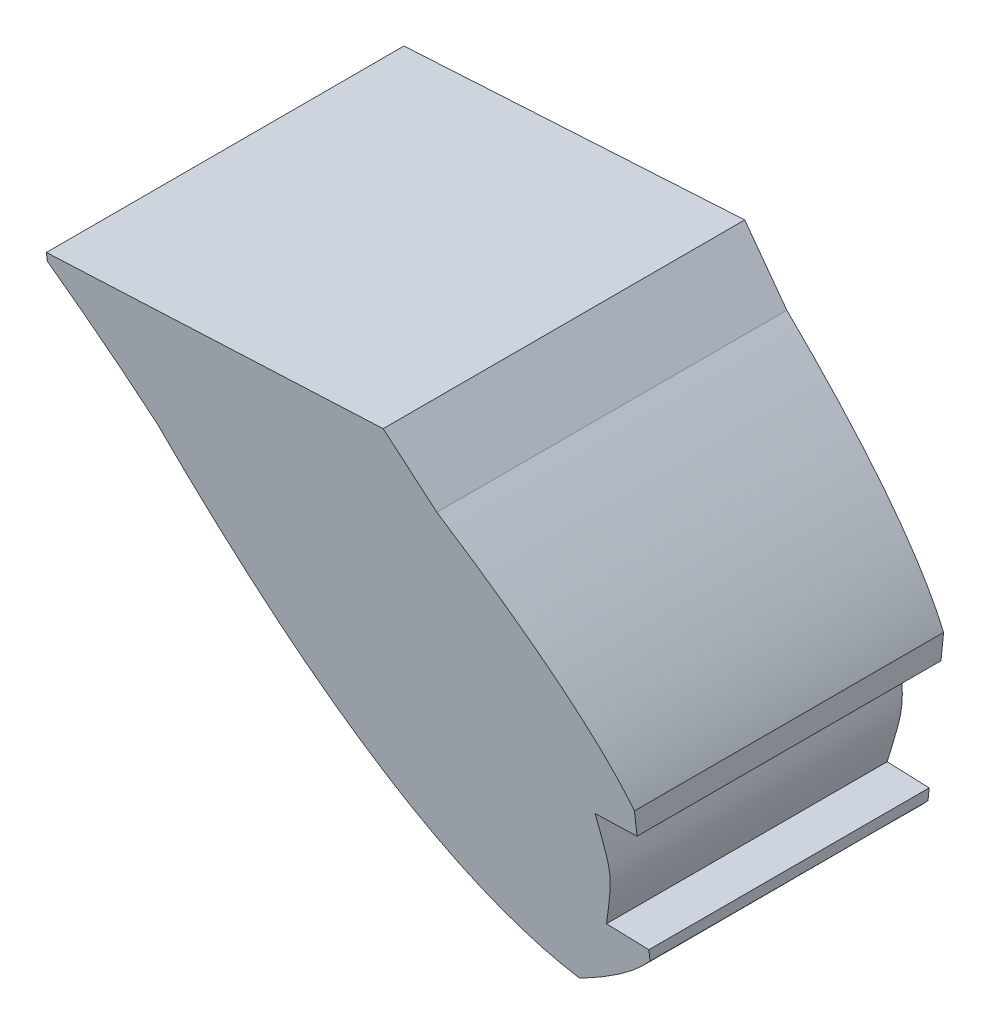
ISO-10303-21;
HEADER;
FILE_DESCRIPTION(('STEP AP214'),'2;1');
FILE_NAME('part.step','',(''),(''),'','','');
FILE_SCHEMA(('AUTOMOTIVE_DESIGN { 1 0 10303 214 1 1 1 1 }'));
ENDSEC;
DATA;
#1=APPLICATION_CONTEXT('core data for automotive mechanical design processes');
#2=APPLICATION_PROTOCOL_DEFINITION('international standard','automotive_design',2000,#1);
#3=PRODUCT_CONTEXT('',#1,'mechanical');
#4=PRODUCT('Part','Part','',(#3));
#5=PRODUCT_RELATED_PRODUCT_CATEGORY('part','',(#4));
#6=PRODUCT_DEFINITION_FORMATION('','',#4);
#7=PRODUCT_DEFINITION_CONTEXT('part definition',#1,'design');
#8=PRODUCT_DEFINITION('design','',#6,#7);
#9=PRODUCT_DEFINITION_SHAPE('','',#8);
#10=(LENGTH_UNIT() NAMED_UNIT(*) SI_UNIT(.MILLI.,.METRE.));
#11=(NAMED_UNIT(*) PLANE_ANGLE_UNIT() SI_UNIT($,.RADIAN.));
#12=(NAMED_UNIT(*) SI_UNIT($,.STERADIAN.) SOLID_ANGLE_UNIT());
#13=UNCERTAINTY_MEASURE_WITH_UNIT(LENGTH_MEASURE(1.E-05),#10,'distance_accuracy_value','');
#14=(GEOMETRIC_REPRESENTATION_CONTEXT(3) GLOBAL_UNCERTAINTY_ASSIGNED_CONTEXT((#13)) GLOBAL_UNIT_ASSIGNED_CONTEXT((#10,
#11,#12)) REPRESENTATION_CONTEXT('',''));
#15=CARTESIAN_POINT('',(0.,0.,0.));
#16=DIRECTION('',(0.,0.,1.));
#17=DIRECTION('',(1.,0.,0.));
#18=AXIS2_PLACEMENT_3D('',#15,#16,#17);
#19=CARTESIAN_POINT('',(0.355125000055651,-1.23774703808888E-13,7.5));
#20=DIRECTION('',(-1.,3.48538412642003E-13,0.));
#21=DIRECTION('',(-3.48538412642003E-13,-1.,0.));
#22=AXIS2_PLACEMENT_3D('',#19,#20,#21);
#23=PLANE('',#22);
#24=DIRECTION('',(0.,-0.993653373689782,0.112485434412263));
#25=VECTOR('',#24,1.);
#26=CARTESIAN_POINT('',(0.355125000056697,12.6081551722012,-7.5));
#27=LINE('',#26,#25);
#28=CARTESIAN_POINT('',(0.355125000056697,3.0015495286345,-6.41249480185305));
#29=VERTEX_POINT('',#28);
#30=CARTESIAN_POINT('',(0.355125000056447,2.03738091179555,-6.30334715682562));
#31=VERTEX_POINT('',#30);
#32=EDGE_CURVE('E59',#29,#31,#27,.T.);
#33=ORIENTED_EDGE('',*,*,#32,.F.);
#34=DIRECTION('',(0.,0.,-1.));
#35=VECTOR('',#34,1.);
#36=CARTESIAN_POINT('',(0.355125000056697,3.0015495286345,7.5));
#37=LINE('',#36,#35);
#38=CARTESIAN_POINT('',(0.355125000056697,3.0015495286345,6.41249480185305));
#39=VERTEX_POINT('',#38);
#40=EDGE_CURVE('E179',#39,#29,#37,.T.);
#41=ORIENTED_EDGE('',*,*,#40,.F.);
#42=DIRECTION('',(0.,0.993653373689782,0.112485434412263));
#43=VECTOR('',#42,1.);
#44=CARTESIAN_POINT('',(0.355125000056697,12.6081551722012,7.5));
#45=LINE('',#44,#43);
#46=CARTESIAN_POINT('',(0.355125000056697,2.03738091179556,6.30334715682562));
#47=VERTEX_POINT('',#46);
#48=EDGE_CURVE('E151',#47,#39,#45,.T.);
#49=ORIENTED_EDGE('',*,*,#48,.F.);
#50=DIRECTION('',(0.,0.,-1.));
#51=VECTOR('',#50,1.);
#52=CARTESIAN_POINT('',(0.355125000056447,2.03738091179555,7.5));
#53=LINE('',#52,#51);
#54=EDGE_CURVE('E166',#47,#31,#53,.T.);
#55=ORIENTED_EDGE('',*,*,#54,.T.);
#56=EDGE_LOOP('',(#33,#41,#49,#55));
#57=FACE_BOUND('',#56,.T.);
#58=ADVANCED_FACE('F41',(#57),#23,.F.);
#59=CARTESIAN_POINT('',(-23.0359211456035,0.,7.5));
#60=DIRECTION('',(-1.,0.,0.));
#61=DIRECTION('',(0.,0.,1.));
#62=AXIS2_PLACEMENT_3D('',#59,#60,#61);
#63=PLANE('',#62);
#64=DIRECTION('',(0.,0.,-1.));
#65=VECTOR('',#64,1.);
#66=CARTESIAN_POINT('',(-23.0359211456035,11.8716122879342,7.5));
#67=LINE('',#66,#65);
#68=CARTESIAN_POINT('',(-23.0359211456035,11.8716122879342,7.41662047501294));
#69=VERTEX_POINT('',#68);
#70=CARTESIAN_POINT('',(-23.0359211456035,11.8716122879342,-7.41662047501294));
#71=VERTEX_POINT('',#70);
#72=EDGE_CURVE('E187',#69,#71,#67,.T.);
#73=ORIENTED_EDGE('',*,*,#72,.T.);
#74=DIRECTION('',(0.,-0.993653373689782,0.112485434412263));
#75=VECTOR('',#74,1.);
#76=CARTESIAN_POINT('',(-23.0359211456035,12.6081551722012,-7.5));
#77=LINE('',#76,#75);
#78=CARTESIAN_POINT('',(-23.0359211456035,11.5401378200983,-7.37909627341673));
#79=VERTEX_POINT('',#78);
#80=EDGE_CURVE('E317',#71,#79,#77,.T.);
#81=ORIENTED_EDGE('',*,*,#80,.T.);
#82=DIRECTION('',(0.,0.,-1.));
#83=VECTOR('',#82,1.);
#84=CARTESIAN_POINT('',(-23.0359211456035,11.5401378200983,7.5));
#85=LINE('',#84,#83);
#86=CARTESIAN_POINT('',(-23.0359211456035,11.5401378200983,7.37909627341673));
#87=VERTEX_POINT('',#86);
#88=EDGE_CURVE('E193',#87,#79,#85,.T.);
#89=ORIENTED_EDGE('',*,*,#88,.F.);
#90=DIRECTION('',(0.,0.993653373689782,0.112485434412263));
#91=VECTOR('',#90,1.);
#92=CARTESIAN_POINT('',(-23.0359211456035,12.6081551722012,7.5));
#93=LINE('',#92,#91);
#94=EDGE_CURVE('E320',#87,#69,#93,.T.);
#95=ORIENTED_EDGE('',*,*,#94,.T.);
#96=EDGE_LOOP('',(#73,#81,#89,#95));
#97=FACE_BOUND('',#96,.T.);
#98=ADVANCED_FACE('F316',(#97),#63,.T.);
#99=CARTESIAN_POINT('',(-18.9451921135982,7.54091889574655,7.5));
#100=CARTESIAN_POINT('',(-10.2150083842792,-3.69764410322756,7.5));
#101=CARTESIAN_POINT('',(-2.84660482498738,-5.05908110388432,7.5));
#102=(BOUNDED_CURVE() B_SPLINE_CURVE(2,(#99,#100,#101),.UNSPECIFIED.,.F.,
.F.) B_SPLINE_CURVE_WITH_KNOTS((3,3),(0.497667241108509,0.499554279588011),
.UNSPECIFIED.) CURVE() GEOMETRIC_REPRESENTATION_ITEM() RATIONAL_B_SPLINE_CURVE((1.,1.,1.)) REPRESENTATION_ITEM(''));
#103=DIRECTION('',(0.,0.,-1.));
#104=VECTOR('',#103,1.);
#105=SURFACE_OF_LINEAR_EXTRUSION('',#102,#104);
#106=DIRECTION('',(0.,0.,-1.));
#107=VECTOR('',#106,1.);
#108=CARTESIAN_POINT('',(-18.9451921135982,7.54091889574657,7.5));
#109=LINE('',#108,#107);
#110=CARTESIAN_POINT('',(-18.9451921135982,7.54091889574657,6.92636910524441));
#111=VERTEX_POINT('',#110);
#112=CARTESIAN_POINT('',(-18.9451921135982,7.54091889574657,-6.92636910524441));
#113=VERTEX_POINT('',#112);
#114=EDGE_CURVE('E194',#111,#113,#109,.T.);
#115=ORIENTED_EDGE('',*,*,#114,.T.);
#116=CARTESIAN_POINT('',(-18.9451921135982,7.54091889574655,-6.92636910524441));
#117=CARTESIAN_POINT('',(-18.7033608655423,7.22962108931645,-6.89112898035273));
#118=CARTESIAN_POINT('',(-18.4592647140916,6.9200497206851,-6.85608429494821));
#119=CARTESIAN_POINT('',(-17.9661198805234,6.30464603742845,-6.78641819962467));
#120=CARTESIAN_POINT('',(-17.7170694462669,5.99881510969872,-6.75179694670763));
#121=CARTESIAN_POINT('',(-17.2137366178937,5.3913665824337,-6.68303140604553));
#122=CARTESIAN_POINT('',(-16.9594535947769,5.08974949683998,-6.64888717648066));
#123=CARTESIAN_POINT('',(-16.4451285665965,4.49103725761873,-6.58111061767257));
#124=CARTESIAN_POINT('',(-16.1850826962375,4.19394537928884,-6.54747865920581));
#125=CARTESIAN_POINT('',(-15.6590118901181,3.60508061675355,-6.4808168731366));
#126=CARTESIAN_POINT('',(-15.3929875534481,3.31330720485499,-6.44778698579723));
#127=CARTESIAN_POINT('',(-14.8544901847056,2.7357195544677,-6.38240181277285));
#128=CARTESIAN_POINT('',(-14.5820174931064,2.44990500284308,-6.35004649163962));
#129=CARTESIAN_POINT('',(-13.9777704357619,1.83142011947111,-6.28003159245484));
#130=CARTESIAN_POINT('',(-13.6445482479649,1.50014167377654,-6.24252958132897));
#131=CARTESIAN_POINT('',(-12.9673134934436,0.848664446736888,-6.16877982026175));
#132=CARTESIAN_POINT('',(-12.623301443116,0.528465136688492,-6.13253201046914));
#133=CARTESIAN_POINT('',(-11.9227759490938,-0.0995013958587513,-6.0614437516454));
#134=CARTESIAN_POINT('',(-11.5662405708663,-0.407244542107335,-6.02660602813964));
#135=CARTESIAN_POINT('',(-10.840142749037,-1.00720368374379,-5.95868831511867));
#136=CARTESIAN_POINT('',(-10.4705807273197,-1.29942018121482,-5.9256082687657));
#137=CARTESIAN_POINT('',(-9.71382699072171,-1.86779135556405,-5.86126643674768));
#138=CARTESIAN_POINT('',(-9.32650636654571,-2.14377746328672,-5.830023733768));
#139=CARTESIAN_POINT('',(-8.5360986768139,-2.67282289543975,-5.77013372902864));
#140=CARTESIAN_POINT('',(-8.13300835344273,-2.92587744631612,-5.74148696765387));
#141=CARTESIAN_POINT('',(-7.31201826568453,-3.40280761684766,-5.68749661363601));
#142=CARTESIAN_POINT('',(-6.89419365451789,-3.62680992502778,-5.66213867935817));
#143=CARTESIAN_POINT('',(-6.04187322097519,-4.0405536088069,-5.61530128189388));
#144=CARTESIAN_POINT('',(-5.60738935372736,-4.23031901573022,-5.59381909826786));
#145=CARTESIAN_POINT('',(-4.78985442909107,-4.54236533838515,-5.55849423842238));
#146=CARTESIAN_POINT('',(-4.4091055725695,-4.67052923075731,-5.54398558631979));
#147=CARTESIAN_POINT('',(-3.82960691198316,-4.83674345690554,-5.52516948814227));
#148=CARTESIAN_POINT('',(-3.63462104960687,-4.8878904691115,-5.51937944702812));
#149=CARTESIAN_POINT('',(-3.24229120544362,-4.9807402777546,-5.50886848683127));
#150=CARTESIAN_POINT('',(-3.0449461414238,-5.02243854990591,-5.50414807991536));
#151=CARTESIAN_POINT('',(-2.84660482498738,-5.05908110388432,-5.5));
#152=B_SPLINE_CURVE_WITH_KNOTS('',3,(#116,#117,#118,#119,#120,#121,#122,#123,#124,#125,#126,
#127,#128,#129,#130,#131,#132,#133,#134,#135,#136,#137,#138,#139,#140,#141,#142,#143,#144,#145,
#146,#147,#148,#149,#150,#151),.UNSPECIFIED.,.F.,.F.,(4,2,2,2,2,2,2,2,2,2,2,2,2,2,2,2,2,4),(0.,
1.1872997216569,2.37502708567824,3.56289806807204,4.75159146291787,5.9401662676152,
7.12867845491363,8.54255640265696,9.95636678593971,11.3727907462706,12.7891688759803,
14.2183172044781,15.6477623519031,17.0707480146133,18.4927309460623,19.6971402338765,
20.3019233237111,20.9069953892921),.UNSPECIFIED.);
#153=CARTESIAN_POINT('',(-2.84660482498738,-5.05908110388432,-5.5));
#154=VERTEX_POINT('',#153);
#155=EDGE_CURVE('E255',#113,#154,#152,.T.);
#156=ORIENTED_EDGE('',*,*,#155,.T.);
#157=DIRECTION('',(0.,0.,-1.));
#158=VECTOR('',#157,1.);
#159=CARTESIAN_POINT('',(-2.84660482498738,-5.05908110388432,7.5));
#160=LINE('',#159,#158);
#161=CARTESIAN_POINT('',(-2.84660482498738,-5.05908110388432,5.5));
#162=VERTEX_POINT('',#161);
#163=EDGE_CURVE('E156',#162,#154,#160,.T.);
#164=ORIENTED_EDGE('',*,*,#163,.F.);
#165=CARTESIAN_POINT('',(-2.84660482498738,-5.05908110388432,5.5));
#166=CARTESIAN_POINT('',(-3.0836355452615,-5.01529762547054,5.50495646039138));
#167=CARTESIAN_POINT('',(-3.31925014057108,-4.96428184629726,5.51073164541478));
#168=CARTESIAN_POINT('',(-3.78628189704186,-4.84911384389608,5.52376911212451));
#169=CARTESIAN_POINT('',(-4.01771143135529,-4.78501130060695,5.53102576984815));
#170=CARTESIAN_POINT('',(-4.47638324853452,-4.64477679089168,5.54690086287615));
#171=CARTESIAN_POINT('',(-4.70363211310207,-4.56866593727755,5.55551690812791));
#172=CARTESIAN_POINT('',(-5.15398016115681,-4.40545252874729,5.57399330205617));
#173=CARTESIAN_POINT('',(-5.37708095327682,-4.31835434125152,5.58385315632366));
#174=CARTESIAN_POINT('',(-5.81545834234536,-4.13567110279715,5.60453361087802));
#175=CARTESIAN_POINT('',(-6.03080317783365,-4.04024711994086,5.61533597762798));
#176=CARTESIAN_POINT('',(-6.45748946905634,-3.84057736608456,5.63793937192645));
#177=CARTESIAN_POINT('',(-6.66882789943329,-3.73632522989765,5.64974112003892));
#178=CARTESIAN_POINT('',(-7.08747417766979,-3.51983158147829,5.67424904476877));
#179=CARTESIAN_POINT('',(-7.29477947597257,-3.40758521204135,5.68695577124062));
#180=CARTESIAN_POINT('',(-7.70530843131035,-3.17590609220346,5.71318275051655));
#181=CARTESIAN_POINT('',(-7.90853147430462,-3.0564722713248,5.72670312450288));
#182=CARTESIAN_POINT('',(-8.45410340689061,-2.72385368196738,5.76435684511426));
#183=CARTESIAN_POINT('',(-8.79259906035209,-2.50440768840731,5.78919898682003));
#184=CARTESIAN_POINT('',(-9.45845448583479,-2.04949644973372,5.8406967119384));
#185=CARTESIAN_POINT('',(-9.78581359629267,-1.81403025542841,5.8673524028032));
#186=CARTESIAN_POINT('',(-10.4302582396863,-1.32938575303013,5.92221604925302));
#187=CARTESIAN_POINT('',(-10.7473396395034,-1.08020203459831,5.95042461730948));
#188=CARTESIAN_POINT('',(-11.3718438106499,-0.570176876647104,6.00816145288252));
#189=CARTESIAN_POINT('',(-11.6792662750814,-0.309335067346119,6.03768976225981));
#190=CARTESIAN_POINT('',(-12.2887351366992,0.225514030316342,6.09823676455314));
#191=CARTESIAN_POINT('',(-12.5906756597182,0.499640146613562,6.12926890925461));
#192=CARTESIAN_POINT('',(-13.1859914625247,1.05668157973797,6.19232817041119));
#193=CARTESIAN_POINT('',(-13.4793699933214,1.33959347409339,6.22435489942917));
#194=CARTESIAN_POINT('',(-14.0582984741035,1.91313890151101,6.28928247705986));
#195=CARTESIAN_POINT('',(-14.3438493181123,2.20377154523463,6.32218322499598));
#196=CARTESIAN_POINT('',(-14.9077244427009,2.7918210558895,6.38875272137508));
#197=CARTESIAN_POINT('',(-15.1860493084316,3.08923736980037,6.42242140721399));
#198=CARTESIAN_POINT('',(-15.7683607406539,3.72540309630891,6.49443784674841));
#199=CARTESIAN_POINT('',(-16.0715178451228,4.06490144250158,6.53287038264566));
#200=CARTESIAN_POINT('',(-16.6701836985208,4.7504922746204,6.61048193675692));
#201=CARTESIAN_POINT('',(-16.9656923307507,5.09658486102068,6.64966096634501));
#202=CARTESIAN_POINT('',(-17.4495199616275,5.67490501691598,6.71512906184765));
#203=CARTESIAN_POINT('',(-17.6398456690967,5.90547984199544,6.74123103065322));
#204=CARTESIAN_POINT('',(-18.0176052393411,6.36895711711416,6.79369846448112));
#205=CARTESIAN_POINT('',(-18.205039097963,6.60185957049552,6.8200639298818));
#206=CARTESIAN_POINT('',(-18.5771476687389,7.06981539005112,6.87303835239394));
#207=CARTESIAN_POINT('',(-18.7618224957771,7.30486866600559,6.89964729929217));
#208=CARTESIAN_POINT('',(-18.9451921135982,7.54091889574655,6.92636910524441));
#209=B_SPLINE_CURVE_WITH_KNOTS('',3,(#165,#166,#167,#168,#169,#170,#171,#172,#173,#174,#175,
#176,#177,#178,#179,#180,#181,#182,#183,#184,#185,#186,#187,#188,#189,#190,#191,#192,#193,#194,
#195,#196,#197,#198,#199,#200,#201,#202,#203,#204,#205,#206,#207,#208),.UNSPECIFIED.,.F.,.F.,(4,
2,2,2,2,2,2,2,2,2,2,2,2,2,2,2,2,2,2,2,2,4),(0.,0.723070627629283,1.44344574109941,
2.16256813451498,2.88140557514503,3.58855192345824,4.2962125448096,5.0043068623572,
5.71250690363926,6.92441762508089,8.13640021448464,9.3488642962315,10.5613668633146,
11.788141520998,13.0144441434254,14.2406061176645,15.4666684871313,16.8368576095009,
18.2070676256843,19.1073954524656,20.0077245721621,20.9080160976373),.UNSPECIFIED.);
#210=EDGE_CURVE('E134',#162,#111,#209,.T.);
#211=ORIENTED_EDGE('',*,*,#210,.T.);
#212=EDGE_LOOP('',(#115,#156,#164,#211));
#213=FACE_BOUND('',#212,.T.);
#214=ADVANCED_FACE('F43',(#213),#105,.F.);
#215=CARTESIAN_POINT('',(-2.84660482498738,-5.05908110388432,7.5));
#216=CARTESIAN_POINT('',(-0.742366881974002,-3.93520659958673,7.5));
#217=CARTESIAN_POINT('',(0.355124999965198,-2.72325322699678,7.5));
#218=(BOUNDED_CURVE() B_SPLINE_CURVE(2,(#215,#216,#217),.UNSPECIFIED.,.F.,
.F.) B_SPLINE_CURVE_WITH_KNOTS((3,3),(0.498812074629495,0.499412845463797),
.UNSPECIFIED.) CURVE() GEOMETRIC_REPRESENTATION_ITEM() RATIONAL_B_SPLINE_CURVE((1.,1.,1.)) REPRESENTATION_ITEM(''));
#219=DIRECTION('',(0.,0.,-1.));
#220=VECTOR('',#219,1.);
#221=SURFACE_OF_LINEAR_EXTRUSION('',#218,#220);
#222=ORIENTED_EDGE('',*,*,#163,.T.);
#223=CARTESIAN_POINT('',(-2.84660482498738,-5.05908110388432,-5.5));
#224=CARTESIAN_POINT('',(-2.67154367534484,-4.96554243060771,-5.51058894235803));
#225=CARTESIAN_POINT('',(-2.49778385523126,-4.86952307483158,-5.52145870764283));
#226=CARTESIAN_POINT('',(-2.15332890723938,-4.67164155861341,-5.54385966647148));
#227=CARTESIAN_POINT('',(-1.9826387176766,-4.56977092703724,-5.55539181898071));
#228=CARTESIAN_POINT('',(-1.64527137465746,-4.35955519460265,-5.5791890591545));
#229=CARTESIAN_POINT('',(-1.47859514121983,-4.25120862887406,-5.59145431264808));
#230=CARTESIAN_POINT('',(-1.15044448784201,-4.02724001195876,-5.61680843294344));
#231=CARTESIAN_POINT('',(-0.98896568487432,-3.911624347545,-5.62989657673763));
#232=CARTESIAN_POINT('',(-0.724614348138144,-3.7114805449727,-5.65255363519824));
#233=CARTESIAN_POINT('',(-0.619967455079453,-3.6292658395869,-5.66186066025876));
#234=CARTESIAN_POINT('',(-0.414118763296717,-3.46070156785231,-5.68094279275538));
#235=CARTESIAN_POINT('',(-0.312916415666604,-3.3743526656372,-5.69071782500895));
#236=CARTESIAN_POINT('',(-0.114288127047669,-3.19685300163986,-5.71081147873311));
#237=CARTESIAN_POINT('',(-0.0168745915935635,-3.10568844995875,-5.721131661274));
#238=CARTESIAN_POINT('',(0.173044677325634,-2.91833195578561,-5.74234114658855));
#239=CARTESIAN_POINT('',(0.265547074526193,-2.82213668167119,-5.75323082651485));
#240=CARTESIAN_POINT('',(0.355124999965198,-2.72325322699678,-5.76442481895703));
#241=B_SPLINE_CURVE_WITH_KNOTS('',3,(#223,#224,#225,#226,#227,#228,#229,#230,#231,#232,#233,
#234,#235,#236,#237,#238,#239,#240),.UNSPECIFIED.,.F.,.F.,(4,2,2,2,2,2,2,2,4),(0.,
0.596333361221146,1.19355295493407,1.79090815604603,2.38774565156578,2.78786762990545,
3.18792554534165,3.58919872466333,3.99074110013676),.UNSPECIFIED.);
#242=CARTESIAN_POINT('',(0.355125000010947,-2.72325322699678,-5.76442481895703));
#243=VERTEX_POINT('',#242);
#244=EDGE_CURVE('E154',#154,#243,#241,.T.);
#245=ORIENTED_EDGE('',*,*,#244,.T.);
#246=DIRECTION('',(0.,0.,-1.));
#247=VECTOR('',#246,1.);
#248=CARTESIAN_POINT('',(0.355124999965198,-2.72325322699678,7.5));
#249=LINE('',#248,#247);
#250=CARTESIAN_POINT('',(0.355125000010947,-2.72325322699678,5.76442481895703));
#251=VERTEX_POINT('',#250);
#252=EDGE_CURVE('E150',#251,#243,#249,.T.);
#253=ORIENTED_EDGE('',*,*,#252,.F.);
#254=CARTESIAN_POINT('',(0.355124999965198,-2.72325322699678,5.76442481895703));
#255=CARTESIAN_POINT('',(0.288265800066398,-2.79707578870119,5.75606781726749));
#256=CARTESIAN_POINT('',(0.219762299322532,-2.86939557158838,5.74788093599675));
#257=CARTESIAN_POINT('',(0.0798741499126207,-3.0111837154317,5.73182996553056));
#258=CARTESIAN_POINT('',(0.00849051694650468,-3.08065306448068,5.72396576447915));
#259=CARTESIAN_POINT('',(-0.209110404202349,-3.28478130911614,5.70085765164865));
#260=CARTESIAN_POINT('',(-0.359086186155244,-3.41549544786354,5.68606030171743));
#261=CARTESIAN_POINT('',(-0.666431647279958,-3.66745151891472,5.65753789253991));
#262=CARTESIAN_POINT('',(-0.823790135326829,-3.78870709059741,5.64381128926277));
#263=CARTESIAN_POINT('',(-1.14463764434189,-4.02329424679429,5.61725510893767));
#264=CARTESIAN_POINT('',(-1.30813354467851,-4.13661650521983,5.60442658763929));
#265=CARTESIAN_POINT('',(-1.58497175174893,-4.31986712055689,5.58368190381061));
#266=CARTESIAN_POINT('',(-1.69701528140079,-4.39175032218513,5.57554444523986));
#267=CARTESIAN_POINT('',(-1.92294333828473,-4.53261962763427,5.55959749086083));
#268=CARTESIAN_POINT('',(-2.03682799400811,-4.6016055280346,5.55178801808056));
#269=CARTESIAN_POINT('',(-2.26591352019373,-4.73675126913538,5.53648899349189));
#270=CARTESIAN_POINT('',(-2.38111062922232,-4.80291742324192,5.52899872698133));
#271=CARTESIAN_POINT('',(-2.6128736149529,-4.93278949726635,5.51429670205848));
#272=CARTESIAN_POINT('',(-2.72943923096306,-4.99649587614853,5.50708489168965));
#273=CARTESIAN_POINT('',(-2.84660482498738,-5.05908110388432,5.5));
#274=B_SPLINE_CURVE_WITH_KNOTS('',3,(#254,#255,#256,#257,#258,#259,#260,#261,#262,#263,#264,
#265,#266,#267,#268,#269,#270,#271,#272,#273),.UNSPECIFIED.,.F.,.F.,(4,2,2,2,2,2,2,2,2,4),(0.,
0.299782926841572,0.599461041577767,1.1974499434567,1.79455995327913,2.39236050766276,
2.79242459253001,3.19251671924541,3.59166012626068,3.99072869445439),.UNSPECIFIED.);
#275=EDGE_CURVE('E129',#251,#162,#274,.T.);
#276=ORIENTED_EDGE('',*,*,#275,.T.);
#277=EDGE_LOOP('',(#222,#245,#253,#276));
#278=FACE_BOUND('',#277,.T.);
#279=ADVANCED_FACE('F152',(#278),#221,.F.);
#280=CARTESIAN_POINT('',(0.355125000532009,-7.39148800447813E-11,7.5));
#281=DIRECTION('',(1.,-2.08137641489758E-10,0.));
#282=DIRECTION('',(2.08137641489758E-10,1.,0.));
#283=AXIS2_PLACEMENT_3D('',#280,#281,#282);
#284=PLANE('',#283);
#285=CARTESIAN_POINT('',(0.355125000056697,-2.28484178142546,-5.81405470319249));
#286=VERTEX_POINT('',#285);
#287=EDGE_CURVE('E147',#286,#243,#27,.T.);
#288=ORIENTED_EDGE('',*,*,#287,.F.);
#289=DIRECTION('',(0.,0.,-1.));
#290=VECTOR('',#289,1.);
#291=CARTESIAN_POINT('',(0.355125000056447,-2.28484178142545,7.5));
#292=LINE('',#291,#290);
#293=CARTESIAN_POINT('',(0.355125000056697,-2.28484178142546,5.81405470319249));
#294=VERTEX_POINT('',#293);
#295=EDGE_CURVE('E149',#294,#286,#292,.T.);
#296=ORIENTED_EDGE('',*,*,#295,.F.);
#297=EDGE_CURVE('E135',#251,#294,#45,.T.);
#298=ORIENTED_EDGE('',*,*,#297,.F.);
#299=ORIENTED_EDGE('',*,*,#252,.T.);
#300=EDGE_LOOP('',(#288,#296,#298,#299));
#301=FACE_BOUND('',#300,.T.);
#302=ADVANCED_FACE('F148',(#301),#284,.T.);
#303=CARTESIAN_POINT('',(-0.0792587195419091,-2.26967276768239,7.5));
#304=DIRECTION('',(-0.0348994967024901,-0.999390827019096,0.));
#305=DIRECTION('',(0.999390827019096,-0.0348994967024901,0.));
#306=AXIS2_PLACEMENT_3D('',#303,#304,#305);
#307=PLANE('',#306);
#308=ORIENTED_EDGE('',*,*,#295,.T.);
#309=DIRECTION('',(-0.999383027616045,0.034899224341334,-0.00395072820626436));
#310=VECTOR('',#309,1.);
#311=CARTESIAN_POINT('',(-0.0266841809929674,-2.27150871102419,-5.81556405872416));
#312=LINE('',#311,#310);
#313=CARTESIAN_POINT('',(-1.39487499994356,-2.22373043481491,-5.8209727457947));
#314=VERTEX_POINT('',#313);
#315=EDGE_CURVE('E299',#286,#314,#312,.T.);
#316=ORIENTED_EDGE('',*,*,#315,.T.);
#317=DIRECTION('',(0.,0.,-1.));
#318=VECTOR('',#317,1.);
#319=CARTESIAN_POINT('',(-1.39487499994356,-2.22373043481491,7.5));
#320=LINE('',#319,#318);
#321=CARTESIAN_POINT('',(-1.39487499994356,-2.22373043481491,5.82097274579469));
#322=VERTEX_POINT('',#321);
#323=EDGE_CURVE('E157',#322,#314,#320,.T.);
#324=ORIENTED_EDGE('',*,*,#323,.F.);
#325=DIRECTION('',(0.999383027616045,-0.034899224341334,-0.00395072820626436));
#326=VECTOR('',#325,1.);
#327=CARTESIAN_POINT('',(-0.0859085417339361,-2.26944055077446,5.81579818252455));
#328=LINE('',#327,#326);
#329=EDGE_CURVE('E325',#322,#294,#328,.T.);
#330=ORIENTED_EDGE('',*,*,#329,.T.);
#331=EDGE_LOOP('',(#308,#316,#324,#330));
#332=FACE_BOUND('',#331,.T.);
#333=ADVANCED_FACE('F334',(#332),#307,.F.);
#334=CARTESIAN_POINT('',(-1.39487499994356,-2.22373043481491,7.5));
#335=CARTESIAN_POINT('',(-0.907530669798052,-0.123730434814926,7.5));
#336=CARTESIAN_POINT('',(-1.39487499994356,1.976269565185,7.5));
#337=(BOUNDED_CURVE() B_SPLINE_CURVE(2,(#334,#335,#336),.UNSPECIFIED.,.F.,
.F.) B_SPLINE_CURVE_WITH_KNOTS((3,3),(0.,1.),
.UNSPECIFIED.) CURVE() GEOMETRIC_REPRESENTATION_ITEM() RATIONAL_B_SPLINE_CURVE((1.,
3.23180121851367,1.)) REPRESENTATION_ITEM(''));
#338=DIRECTION('',(0.,0.,-1.));
#339=VECTOR('',#338,1.);
#340=SURFACE_OF_LINEAR_EXTRUSION('',#337,#339);
#341=ORIENTED_EDGE('',*,*,#323,.T.);
#342=CARTESIAN_POINT('',(-1.39487499994356,-2.22373043481491,-5.8209727457947));
#343=CARTESIAN_POINT('',(-1.38202447122813,-2.16835021356968,-5.82724200266994));
#344=CARTESIAN_POINT('',(-1.36921744547373,-2.11295996104296,-5.83351239512535));
#345=CARTESIAN_POINT('',(-1.34371955909939,-2.00215267308472,-5.84605621196536));
#346=CARTESIAN_POINT('',(-1.33102869927897,-1.94673563747162,-5.85232963637053));
#347=CARTESIAN_POINT('',(-1.30579250980865,-1.83586894873068,-5.86488017761064));
#348=CARTESIAN_POINT('',(-1.29324717983284,-1.78041929567618,-5.87115729443729));
#349=CARTESIAN_POINT('',(-1.26834035470031,-1.66945670178657,-5.883718692514));
#350=CARTESIAN_POINT('',(-1.25597893242913,-1.61394374477822,-5.89000297559494));
#351=CARTESIAN_POINT('',(-1.23150428056634,-1.50286329328951,-5.90257771561119));
#352=CARTESIAN_POINT('',(-1.21939105277074,-1.44729579841754,-5.90886817259083));
#353=CARTESIAN_POINT('',(-1.19550012207595,-1.33608743052918,-5.92145739324204));
#354=CARTESIAN_POINT('',(-1.1837224309966,-1.2804465549999,-5.92775615719808));
#355=CARTESIAN_POINT('',(-1.15485704104805,-1.14125615214793,-5.94351305326002));
#356=CARTESIAN_POINT('',(-1.13805530724695,-1.05764770999797,-5.95297785475397));
#357=CARTESIAN_POINT('',(-1.10616760722362,-0.890046794372652,-5.97195093158457));
#358=CARTESIAN_POINT('',(-1.09108267359643,-0.806054121054038,-5.98145922954426));
#359=CARTESIAN_POINT('',(-1.06839764881353,-0.664871544058104,-5.99744164748328));
#360=CARTESIAN_POINT('',(-1.05995626751594,-0.607817685780514,-6.00390036659317));
#361=CARTESIAN_POINT('',(-1.04516806244473,-0.493450404650502,-6.01684718853439));
#362=CARTESIAN_POINT('',(-1.03882061818002,-0.436137063802354,-6.02333528208253));
#363=CARTESIAN_POINT('',(-1.02903068414648,-0.32130807468907,-6.03633437116685));
#364=CARTESIAN_POINT('',(-1.02558541499307,-0.263792673078832,-6.04284533878074));
#365=CARTESIAN_POINT('',(-1.02222407231355,-0.148714957691158,-6.05587258464866));
#366=CARTESIAN_POINT('',(-1.02230420900467,-0.0911527608046727,-6.06238884967019));
#367=CARTESIAN_POINT('',(-1.02596900528622,0.0239015023985971,-6.07541344065945));
#368=CARTESIAN_POINT('',(-1.02955657044098,0.0813934710005599,-6.08192175556548));
#369=CARTESIAN_POINT('',(-1.03959132289802,0.19613338530381,-6.09491076103415));
#370=CARTESIAN_POINT('',(-1.04603929917214,0.253381259276288,-6.10139144347682));
#371=CARTESIAN_POINT('',(-1.05997220439613,0.35983137212623,-6.1134420111136));
#372=CARTESIAN_POINT('',(-1.06719667195452,0.409068491171902,-6.11901584487869));
#373=CARTESIAN_POINT('',(-1.08274764683563,0.507347946837772,-6.13014146227917));
#374=CARTESIAN_POINT('',(-1.0910737056158,0.556390354412903,-6.13569325394695));
#375=CARTESIAN_POINT('',(-1.10853037258208,0.654424381213792,-6.14679108784343));
#376=CARTESIAN_POINT('',(-1.11766242226862,0.70341574413319,-6.15233710105724));
#377=CARTESIAN_POINT('',(-1.1364977866421,0.801294033672846,-6.1634173048888));
#378=CARTESIAN_POINT('',(-1.14620115522269,0.850180949988233,-6.16895149433999));
#379=CARTESIAN_POINT('',(-1.16833495400599,0.959258362431623,-6.18129948252998));
#380=CARTESIAN_POINT('',(-1.1808737668477,1.01942705832357,-6.18811081339709));
#381=CARTESIAN_POINT('',(-1.20639174214038,1.13967062360227,-6.20172285360526));
#382=CARTESIAN_POINT('',(-1.21937089694786,1.19974549459873,-6.20852356312855));
#383=CARTESIAN_POINT('',(-1.24564626429316,1.31982703510014,-6.22211726150049));
#384=CARTESIAN_POINT('',(-1.2589424791072,1.37983370411223,-6.22891025029334));
#385=CARTESIAN_POINT('',(-1.28569888355067,1.49948275843749,-6.24245498954463));
#386=CARTESIAN_POINT('',(-1.29915785770072,1.55912541262012,-6.24920677044014));
#387=CARTESIAN_POINT('',(-1.32625009614692,1.67837055204035,-6.26270578495002));
#388=CARTESIAN_POINT('',(-1.33988335761135,1.73797303791406,-6.26945301863641));
#389=CARTESIAN_POINT('',(-1.36728618039678,1.85714403003134,-6.28294363938263));
#390=CARTESIAN_POINT('',(-1.381055735056,1.91671253778666,-6.2896870266136));
#391=CARTESIAN_POINT('',(-1.39487499994356,1.976269565185,-6.29642911422342));
#392=B_SPLINE_CURVE_WITH_KNOTS('',3,(#342,#343,#344,#345,#346,#347,#348,#349,#350,#351,#352,
#353,#354,#355,#356,#357,#358,#359,#360,#361,#362,#363,#364,#365,#366,#367,#368,#369,#370,#371,
#372,#373,#374,#375,#376,#377,#378,#379,#380,#381,#382,#383,#384,#385,#386,#387,#388,#389,#390,
#391),.UNSPECIFIED.,.F.,.F.,(4,2,2,2,2,2,2,2,2,2,2,2,2,2,2,2,2,2,2,2,2,2,2,2,4),(0.,
0.171588763273453,0.343178706622211,0.514768265617105,0.686424107910213,0.858081191922479,
1.02974431538338,1.28714724145325,1.54470417716686,1.71878537631805,1.8928149439917,
2.06667765516018,2.24035346989174,2.41417328020677,2.58804106414591,2.73825198714263,
2.88840193486919,3.03882608638502,3.18926445051695,3.37477476712053,3.56028186526787,
3.74579029559563,3.93033206952695,4.11487084894101,4.29940065253389),.UNSPECIFIED.);
#393=CARTESIAN_POINT('',(-1.39487499994356,1.976269565185,-6.29642911422342));
#394=VERTEX_POINT('',#393);
#395=EDGE_CURVE('E177',#314,#394,#392,.T.);
#396=ORIENTED_EDGE('',*,*,#395,.T.);
#397=DIRECTION('',(0.,0.,-1.));
#398=VECTOR('',#397,1.);
#399=CARTESIAN_POINT('',(-1.39487499994356,1.976269565185,7.5));
#400=LINE('',#399,#398);
#401=CARTESIAN_POINT('',(-1.39487499994356,1.976269565185,6.29642911422342));
#402=VERTEX_POINT('',#401);
#403=EDGE_CURVE('E170',#402,#394,#400,.T.);
#404=ORIENTED_EDGE('',*,*,#403,.F.);
#405=CARTESIAN_POINT('',(-1.39487499994356,1.976269565185,6.29642911422342));
#406=CARTESIAN_POINT('',(-1.37907511533365,1.90817072448153,6.28872006005792));
#407=CARTESIAN_POINT('',(-1.36333836969219,1.84005724657732,6.28100934890426));
#408=CARTESIAN_POINT('',(-1.33204781411177,1.703774616767,6.26558162408294));
#409=CARTESIAN_POINT('',(-1.31649404111311,1.63560545649229,6.25786460946793));
#410=CARTESIAN_POINT('',(-1.28563112684324,1.49920642241426,6.24242370722985));
#411=CARTESIAN_POINT('',(-1.27032200601989,1.43097654403409,6.23469981908867));
#412=CARTESIAN_POINT('',(-1.2399275173513,1.29390485970128,6.21918277022027));
#413=CARTESIAN_POINT('',(-1.22484485449072,1.22506245970345,6.21138954224482));
#414=CARTESIAN_POINT('',(-1.19518112320204,1.0872751663326,6.19579148364441));
#415=CARTESIAN_POINT('',(-1.18060002365467,1.01833027959621,6.18798665377074));
#416=CARTESIAN_POINT('',(-1.1521828568661,0.880291295746957,6.17236010282727));
#417=CARTESIAN_POINT('',(-1.13834675067045,0.81119720663251,6.16453838266292));
#418=CARTESIAN_POINT('',(-1.11516473949854,0.690174385789182,6.15083812768789));
#419=CARTESIAN_POINT('',(-1.10556404533104,0.638294159941606,6.14496508393199));
#420=CARTESIAN_POINT('',(-1.08728934318226,0.534373551286744,6.1332008660282));
#421=CARTESIAN_POINT('',(-1.07861528667302,0.482333177013413,6.12730969284637));
#422=CARTESIAN_POINT('',(-1.06260440200736,0.378149691610768,6.11551571627023));
#423=CARTESIAN_POINT('',(-1.05526500549272,0.326006977236308,6.10961295779011));
#424=CARTESIAN_POINT('',(-1.04244257361275,0.221494061638693,6.09778168843203));
#425=CARTESIAN_POINT('',(-1.03695934618146,0.169123884520429,6.09185318028283));
#426=CARTESIAN_POINT('',(-1.02917052981484,0.0729301509045448,6.08096367474698));
#427=CARTESIAN_POINT('',(-1.02648754730517,0.0291375389214666,6.07600618039996));
#428=CARTESIAN_POINT('',(-1.02311803398459,-0.0585228047861237,6.06608268785843));
#429=CARTESIAN_POINT('',(-1.02243133042271,-0.10239052968188,6.06111669043696));
#430=CARTESIAN_POINT('',(-1.02313587995194,-0.190112899664059,6.05118617627941));
#431=CARTESIAN_POINT('',(-1.02452732528276,-0.233967543165022,6.04622165972282));
#432=CARTESIAN_POINT('',(-1.02922830316647,-0.321575626235211,6.03630408328911));
#433=CARTESIAN_POINT('',(-1.03253802615093,-0.365329055323649,6.03135102459847));
#434=CARTESIAN_POINT('',(-1.04481913269156,-0.496026010219698,6.01655561994619));
#435=CARTESIAN_POINT('',(-1.05614963950478,-0.582745183351364,6.00673867158183));
#436=CARTESIAN_POINT('',(-1.08246686740171,-0.755641929816293,5.98716608606103));
#437=CARTESIAN_POINT('',(-1.09745579058543,-0.841819144762871,5.97741048947536));
#438=CARTESIAN_POINT('',(-1.129420439335,-1.01366509487318,5.95795685819712));
#439=CARTESIAN_POINT('',(-1.14639302616418,-1.09933441387988,5.94825875741124));
#440=CARTESIAN_POINT('',(-1.18149622255001,-1.27039766561497,5.92889373063944));
#441=CARTESIAN_POINT('',(-1.19962634896168,-1.35579169781193,5.91922679339328));
#442=CARTESIAN_POINT('',(-1.24641099322308,-1.57177275123237,5.89477689641502));
#443=CARTESIAN_POINT('',(-1.2755379218154,-1.70225834502177,5.88000541866374));
#444=CARTESIAN_POINT('',(-1.31987060164556,-1.89787014932725,5.85786140006925));
#445=CARTESIAN_POINT('',(-1.33475842772637,-1.96306843680887,5.85048069983263));
#446=CARTESIAN_POINT('',(-1.36470186719661,-2.09342597092531,5.83572371893541));
#447=CARTESIAN_POINT('',(-1.37975747811874,-2.15858521811941,5.82834743821149));
#448=CARTESIAN_POINT('',(-1.39487499994356,-2.22373043481491,5.82097274579469));
#449=B_SPLINE_CURVE_WITH_KNOTS('',3,(#405,#406,#407,#408,#409,#410,#411,#412,#413,#414,#415,
#416,#417,#418,#419,#420,#421,#422,#423,#424,#425,#426,#427,#428,#429,#430,#431,#432,#433,#434,
#435,#436,#437,#438,#439,#440,#441,#442,#443,#444,#445,#446,#447,#448),.UNSPECIFIED.,.F.,.F.,(4,
2,2,2,2,2,2,2,2,2,2,2,2,2,2,2,2,2,2,2,2,4),(0.,0.210994688118994,0.422031267037357,
0.633085392962154,0.845798629208893,1.05849864386888,1.27118752598179,1.4304428147189,
1.58968975917224,1.7486269361582,1.90754766218714,2.03996993828288,2.1723807546786,
2.3048038205294,2.43724003455642,2.70109168787962,2.96510255404672,3.22870119353186,
3.49219051999256,3.89571487778355,4.09756249770236,4.29940715332609),.UNSPECIFIED.);
#450=EDGE_CURVE('E64',#402,#322,#449,.T.);
#451=ORIENTED_EDGE('',*,*,#450,.T.);
#452=EDGE_LOOP('',(#341,#396,#404,#451));
#453=FACE_BOUND('',#452,.T.);
#454=ADVANCED_FACE('F173',(#453),#340,.F.);
#455=CARTESIAN_POINT('',(0.355125000056697,3.0015495286345,7.5));
#456=CARTESIAN_POINT('',(-1.44872627004384,6.0584273141466,7.5));
#457=CARTESIAN_POINT('',(-6.99487502582887,10.4773899922143,7.5));
#458=(BOUNDED_CURVE() B_SPLINE_CURVE(2,(#455,#456,#457),.UNSPECIFIED.,.F.,
.F.) B_SPLINE_CURVE_WITH_KNOTS((3,3),(0.500820705122982,0.502013311782223),
.UNSPECIFIED.) CURVE() GEOMETRIC_REPRESENTATION_ITEM() RATIONAL_B_SPLINE_CURVE((1.,1.,1.)) REPRESENTATION_ITEM(''));
#459=DIRECTION('',(0.,0.,-1.));
#460=VECTOR('',#459,1.);
#461=SURFACE_OF_LINEAR_EXTRUSION('',#458,#460);
#462=ORIENTED_EDGE('',*,*,#40,.T.);
#463=CARTESIAN_POINT('',(0.355125000056697,3.0015495286345,-6.41249480185305));
#464=CARTESIAN_POINT('',(0.304611825062614,3.08713910892722,-6.42218387590574));
#465=CARTESIAN_POINT('',(0.252829574975965,3.17197675667728,-6.43178782826414));
#466=CARTESIAN_POINT('',(0.146996425684332,3.34022678950728,-6.45083438769209));
#467=CARTESIAN_POINT('',(0.0929458709863079,3.42363938833331,-6.46027701895852));
#468=CARTESIAN_POINT('',(-0.0720259816016992,3.67159280703978,-6.4883463122913));
#469=CARTESIAN_POINT('',(-0.185954424573863,3.83416207979728,-6.50674978753972));
#470=CARTESIAN_POINT('',(-0.420195702371685,4.15456473361426,-6.54302061663943));
#471=CARTESIAN_POINT('',(-0.540506139916056,4.3123998585806,-6.56088816790776));
#472=CARTESIAN_POINT('',(-0.785880610008438,4.62328354155297,-6.59608141241009));
#473=CARTESIAN_POINT('',(-0.910922246407595,4.77634960365364,-6.61340908717582));
#474=CARTESIAN_POINT('',(-1.16542402575789,5.0789091469452,-6.64766000662507));
#475=CARTESIAN_POINT('',(-1.29488601263671,5.22840109188721,-6.66458307739923));
#476=CARTESIAN_POINT('',(-1.55752786665308,5.52415387167798,-6.69806344469258));
#477=CARTESIAN_POINT('',(-1.6907082385264,5.67041426299934,-6.71462069100275));
#478=CARTESIAN_POINT('',(-1.95676457683924,5.9562751983388,-6.74698126295326));
#479=CARTESIAN_POINT('',(-2.08955967948613,6.0959502005499,-6.76279301755123));
#480=CARTESIAN_POINT('',(-2.35774738083663,6.37276289931955,-6.79412929385883));
#481=CARTESIAN_POINT('',(-2.49313949667974,6.50990105841303,-6.80965386792921));
#482=CARTESIAN_POINT('',(-2.76622057988734,6.78188630008672,-6.84044365727978));
#483=CARTESIAN_POINT('',(-2.90390945120438,6.91673347799924,-6.85570888335196));
#484=CARTESIAN_POINT('',(-3.18157989443261,7.18458262668443,-6.88603045085686));
#485=CARTESIAN_POINT('',(-3.32156519397778,7.31758077815757,-6.90108635992999));
#486=CARTESIAN_POINT('',(-3.60336702010312,7.58165632334332,-6.9309807408121));
#487=CARTESIAN_POINT('',(-3.74518361420142,7.7127336458542,-6.94581920456076));
#488=CARTESIAN_POINT('',(-4.03045824598403,7.9731143136119,-6.97529531091817));
#489=CARTESIAN_POINT('',(-4.17391630095381,8.10241764014601,-6.98993295140857));
#490=CARTESIAN_POINT('',(-4.46327774044283,8.36024031964194,-7.01911948352564));
#491=CARTESIAN_POINT('',(-4.60919106044248,8.48874865574429,-7.03366712800089));
#492=CARTESIAN_POINT('',(-4.902378301708,8.74421850432193,-7.06258731048845));
#493=CARTESIAN_POINT('',(-5.04965220356223,8.87118003880593,-7.07695985099224));
#494=CARTESIAN_POINT('',(-5.34544402422968,9.12366570876955,-7.10554221283062));
#495=CARTESIAN_POINT('',(-5.49396195264949,9.24918983313146,-7.11975203290664));
#496=CARTESIAN_POINT('',(-5.7916881453551,9.49851914833085,-7.14797708308463));
#497=CARTESIAN_POINT('',(-5.94089298845833,9.62232837448879,-7.16199277000059));
#498=CARTESIAN_POINT('',(-6.24034209654586,9.86869525036086,-7.18988246050136));
#499=CARTESIAN_POINT('',(-6.39058634943962,9.99125291459239,-7.20375646572961));
#500=CARTESIAN_POINT('',(-6.69203115149199,10.2351870903959,-7.23137076510179));
#501=CARTESIAN_POINT('',(-6.84323165475483,10.356563657956,-7.24511106558381));
#502=CARTESIAN_POINT('',(-6.99487502582887,10.4773899922143,-7.25878907751167));
#503=B_SPLINE_CURVE_WITH_KNOTS('',3,(#463,#464,#465,#466,#467,#468,#469,#470,#471,#472,#473,
#474,#475,#476,#477,#478,#479,#480,#481,#482,#483,#484,#485,#486,#487,#488,#489,#490,#491,#492,
#493,#494,#495,#496,#497,#498,#499,#500,#501,#502),.UNSPECIFIED.,.F.,.F.,(4,2,2,2,2,2,2,2,2,2,2,
2,2,2,2,2,2,2,2,4),(0.,0.299537168074909,0.599029006346325,1.19691549709242,1.7945789713371,
2.38970027938851,2.98507294745423,3.58052682848059,4.16061190167034,4.74059014597745,
5.32054419682562,5.90155732652809,6.48259193915569,7.06363267602949,7.64855709920549,
8.23347319002028,8.81839380183376,9.40155465760286,9.98470874134178,10.5678350455167),.UNSPECIFIED.);
#504=CARTESIAN_POINT('',(-6.99487502582887,10.4773899922143,-7.25878907751168));
#505=VERTEX_POINT('',#504);
#506=EDGE_CURVE('E228',#29,#505,#503,.T.);
#507=ORIENTED_EDGE('',*,*,#506,.T.);
#508=DIRECTION('',(0.,0.,-1.));
#509=VECTOR('',#508,1.);
#510=CARTESIAN_POINT('',(-6.99487502582887,10.4773899922143,7.5));
#511=LINE('',#510,#509);
#512=CARTESIAN_POINT('',(-6.99487502582887,10.4773899922143,7.25878907751167));
#513=VERTEX_POINT('',#512);
#514=EDGE_CURVE('E178',#513,#505,#511,.T.);
#515=ORIENTED_EDGE('',*,*,#514,.F.);
#516=CARTESIAN_POINT('',(-6.99487502582887,10.4773899922143,7.25878907751167));
#517=CARTESIAN_POINT('',(-6.8413729328842,10.3550825633836,7.24494339990603));
#518=CARTESIAN_POINT('',(-6.68832454473299,10.2322113968793,7.23103390499871));
#519=CARTESIAN_POINT('',(-6.38320800729791,9.98525754721245,7.20307776677678));
#520=CARTESIAN_POINT('',(-6.23113990898295,9.86117480188558,7.18903111642493));
#521=CARTESIAN_POINT('',(-5.92807065524143,9.61172472707623,7.16079239578847));
#522=CARTESIAN_POINT('',(-5.77706951376426,9.4863573808512,7.14660032360854));
#523=CARTESIAN_POINT('',(-5.47576586823065,9.23386151969447,7.11801680808739));
#524=CARTESIAN_POINT('',(-5.32546696630186,9.10672875882622,7.10362488408959));
#525=CARTESIAN_POINT('',(-5.02614983518305,8.85098522990144,7.07467371992013));
#526=CARTESIAN_POINT('',(-4.87713159456568,8.72237447505705,7.06011448124413));
#527=CARTESIAN_POINT('',(-4.58049768691917,8.4635608439173,7.03081576953901));
#528=CARTESIAN_POINT('',(-4.43288203846827,8.33335794658506,7.01607629412843));
#529=CARTESIAN_POINT('',(-4.14210139347426,8.07382538694137,6.98669619691481));
#530=CARTESIAN_POINT('',(-3.99890608102053,7.94452928138955,6.97205937386774));
#531=CARTESIAN_POINT('',(-3.71416611319349,7.68415632984108,6.94258414101528));
#532=CARTESIAN_POINT('',(-3.57262144073419,7.55307950230738,6.92774573329996));
#533=CARTESIAN_POINT('',(-3.29137414395358,7.28899712986201,6.89785057954546));
#534=CARTESIAN_POINT('',(-3.1516714542651,7.15599165374669,6.88279384129429));
#535=CARTESIAN_POINT('',(-2.87458175917985,6.88812206371671,6.85246995974949));
#536=CARTESIAN_POINT('',(-2.73719095714564,6.75326183141828,6.83720325586995));
#537=CARTESIAN_POINT('',(-2.4647217040658,6.4812406817504,6.80640940159449));
#538=CARTESIAN_POINT('',(-2.3296433470098,6.344079671312,6.79088224066282));
#539=CARTESIAN_POINT('',(-2.06210260883396,6.06721026914355,6.75953954530947));
#540=CARTESIAN_POINT('',(-1.92964070354025,5.92750142279085,6.74372395942274));
#541=CARTESIAN_POINT('',(-1.66562238661239,5.64300124412993,6.71151743043145));
#542=CARTESIAN_POINT('',(-1.53411576395753,5.49816420330923,6.69512131294512));
#543=CARTESIAN_POINT('',(-1.27477241827144,5.20530942617558,6.6619690108468));
#544=CARTESIAN_POINT('',(-1.146935201756,5.05729212228994,6.64521287518726));
#545=CARTESIAN_POINT('',(-0.895619086203261,4.75774147994064,6.61130257505109));
#546=CARTESIAN_POINT('',(-0.772138401037261,4.60620962564755,6.59414857858836));
#547=CARTESIAN_POINT('',(-0.529814215553586,4.29847884173296,6.55931225454699));
#548=CARTESIAN_POINT('',(-0.410992610293168,4.14226283985584,6.54162799432248));
#549=CARTESIAN_POINT('',(-0.179619110055475,3.82518978007974,6.50573408824445));
#550=CARTESIAN_POINT('',(-0.0670695368194353,3.66433103656916,6.48752425157313));
#551=CARTESIAN_POINT('',(0.0959476258682439,3.41902899751658,6.45975510475025));
#552=CARTESIAN_POINT('',(0.149364159232856,3.33651676897211,6.45041439890865));
#553=CARTESIAN_POINT('',(0.253976160624149,3.17009812823874,6.43157516020342));
#554=CARTESIAN_POINT('',(0.305171300426591,3.0861915125367,6.42207660430132));
#555=CARTESIAN_POINT('',(0.355125000056697,3.0015495286345,6.41249480185305));
#556=B_SPLINE_CURVE_WITH_KNOTS('',3,(#516,#517,#518,#519,#520,#521,#522,#523,#524,#525,#526,
#527,#528,#529,#530,#531,#532,#533,#534,#535,#536,#537,#538,#539,#540,#541,#542,#543,#544,#545,
#546,#547,#548,#549,#550,#551,#552,#553,#554,#555),.UNSPECIFIED.,.F.,.F.,(4,2,2,2,2,2,2,2,2,2,2,
2,2,2,2,2,2,2,2,4),(0.,0.590274012205936,1.18057847133787,1.77089063387541,2.36302742672822,
2.95515893044104,3.54729826641975,4.12774064799354,4.70817701598977,5.28859273006671,
5.86793765731305,6.4473060764699,7.02677890672858,7.61567889581169,8.20449931137601,
8.79307544349984,9.38414853693651,9.97543899618637,10.2716165714927,10.5678377608222),.UNSPECIFIED.);
#557=EDGE_CURVE('E219',#513,#39,#556,.T.);
#558=ORIENTED_EDGE('',*,*,#557,.T.);
#559=EDGE_LOOP('',(#462,#507,#515,#558));
#560=FACE_BOUND('',#559,.T.);
#561=ADVANCED_FACE('F207',(#560),#461,.F.);
#562=CARTESIAN_POINT('',(1.48452736456058,1.38434415860098,7.5));
#563=DIRECTION('',(0.731353702758341,0.681998358840887,0.));
#564=DIRECTION('',(-0.681998358840887,0.731353702758341,0.));
#565=AXIS2_PLACEMENT_3D('',#562,#563,#564);
#566=PLANE('',#565);
#567=DIRECTION('',(0.679672917760627,-0.728859972498513,0.0825097894326689));
#568=VECTOR('',#567,1.);
#569=CARTESIAN_POINT('',(2.25446874596091,0.55868310986907,-6.13595280280002));
#570=LINE('',#569,#568);
#571=CARTESIAN_POINT('',(-8.98184569453068,12.6081551722012,-7.5));
#572=VERTEX_POINT('',#571);
#573=EDGE_CURVE('E236',#572,#505,#570,.T.);
#574=ORIENTED_EDGE('',*,*,#573,.F.);
#575=DIRECTION('',(0.,0.,-1.));
#576=VECTOR('',#575,1.);
#577=CARTESIAN_POINT('',(-8.98184569452943,12.6081551722012,7.5));
#578=LINE('',#577,#576);
#579=CARTESIAN_POINT('',(-8.98184569453193,12.6081551722011,7.49999999999999));
#580=VERTEX_POINT('',#579);
#581=EDGE_CURVE('E183',#580,#572,#578,.T.);
#582=ORIENTED_EDGE('',*,*,#581,.F.);
#583=DIRECTION('',(-0.679672917760627,0.728859972498513,0.0825097894326689));
#584=VECTOR('',#583,1.);
#585=CARTESIAN_POINT('',(1.41327370604816,1.46075435272037,6.23807078308337));
#586=LINE('',#585,#584);
#587=EDGE_CURVE('E293',#513,#580,#586,.T.);
#588=ORIENTED_EDGE('',*,*,#587,.F.);
#589=ORIENTED_EDGE('',*,*,#514,.T.);
#590=EDGE_LOOP('',(#574,#582,#588,#589));
#591=FACE_BOUND('',#590,.T.);
#592=ADVANCED_FACE('F212',(#591),#566,.T.);
#593=CARTESIAN_POINT('',(-0.683557287645435,13.0430500394562,7.5));
#594=DIRECTION('',(0.0523359562429403,-0.998629534754574,0.));
#595=DIRECTION('',(0.998629534754574,0.0523359562429403,0.));
#596=AXIS2_PLACEMENT_3D('',#593,#594,#595);
#597=PLANE('',#596);
#598=ORIENTED_EDGE('',*,*,#581,.T.);
#599=DIRECTION('',(-0.998612008623237,-0.0523350377373175,0.00592453023432517));
#600=VECTOR('',#599,1.);
#601=CARTESIAN_POINT('',(-0.772593163615673,13.03838386692,-7.54870356494878));
#602=LINE('',#601,#600);
#603=EDGE_CURVE('E264',#572,#71,#602,.T.);
#604=ORIENTED_EDGE('',*,*,#603,.T.);
#605=ORIENTED_EDGE('',*,*,#72,.F.);
#606=DIRECTION('',(0.998612008623237,0.0523350377373175,0.00592453023432517));
#607=VECTOR('',#606,1.);
#608=CARTESIAN_POINT('',(-0.683848558053945,13.0430347746209,7.54923006582624));
#609=LINE('',#608,#607);
#610=EDGE_CURVE('E137',#69,#580,#609,.T.);
#611=ORIENTED_EDGE('',*,*,#610,.T.);
#612=EDGE_LOOP('',(#598,#604,#605,#611));
#613=FACE_BOUND('',#612,.T.);
#614=ADVANCED_FACE('F349',(#613),#597,.F.);
#615=CARTESIAN_POINT('',(-69.8841339427642,-40.4718315495759,7.5));
#616=DIRECTION('',(0.,0.,-1.));
#617=DIRECTION('',(-1.,0.,0.));
#618=AXIS2_PLACEMENT_3D('',#615,#616,#617);
#619=CYLINDRICAL_SURFACE('',#618,69.9999999999998);
#620=CARTESIAN_POINT('',(-69.8841339427642,-40.4718315495759,-1.49113863738535));
#621=DIRECTION('',(0.,0.112485434412263,0.993653373689781));
#622=DIRECTION('',(0.,0.993653373689782,-0.112485434412263));
#623=AXIS2_PLACEMENT_3D('',#620,#621,#622);
#624=ELLIPSE('',#623,70.4471014273976,69.9999999999998);
#625=EDGE_CURVE('E305',#113,#79,#624,.T.);
#626=ORIENTED_EDGE('',*,*,#625,.F.);
#627=ORIENTED_EDGE('',*,*,#114,.F.);
#628=CARTESIAN_POINT('',(-69.8841339427642,-40.4718315495759,1.49113863738535));
#629=DIRECTION('',(0.,0.112485434412263,-0.993653373689781));
#630=DIRECTION('',(0.,-0.993653373689782,-0.112485434412263));
#631=AXIS2_PLACEMENT_3D('',#628,#629,#630);
#632=ELLIPSE('',#631,70.4471014273976,69.9999999999998);
#633=EDGE_CURVE('E311',#87,#111,#632,.T.);
#634=ORIENTED_EDGE('',*,*,#633,.F.);
#635=ORIENTED_EDGE('',*,*,#88,.T.);
#636=EDGE_LOOP('',(#626,#627,#634,#635));
#637=FACE_BOUND('',#636,.T.);
#638=ADVANCED_FACE('F309',(#637),#619,.F.);
#639=CARTESIAN_POINT('',(-1.39487499994356,1.976269565185,7.5));
#640=DIRECTION('',(-0.0348994967024943,0.999390827019096,0.));
#641=DIRECTION('',(-0.999390827019096,-0.0348994967024943,0.));
#642=AXIS2_PLACEMENT_3D('',#639,#640,#641);
#643=PLANE('',#642);
#644=ORIENTED_EDGE('',*,*,#403,.T.);
#645=DIRECTION('',(0.999383027616045,0.0348992243413382,-0.00395072820626483));
#646=VECTOR('',#645,1.);
#647=CARTESIAN_POINT('',(-1.4493473129301,1.97436735009952,-6.29621377606234));
#648=LINE('',#647,#646);
#649=EDGE_CURVE('E11',#394,#31,#648,.T.);
#650=ORIENTED_EDGE('',*,*,#649,.T.);
#651=ORIENTED_EDGE('',*,*,#54,.F.);
#652=DIRECTION('',(-0.999383027616045,-0.0348992243413382,-0.00395072820626483));
#653=VECTOR('',#652,1.);
#654=CARTESIAN_POINT('',(-1.39012295218912,1.97643551034925,6.29644789986274));
#655=LINE('',#654,#653);
#656=EDGE_CURVE('E51',#47,#402,#655,.T.);
#657=ORIENTED_EDGE('',*,*,#656,.T.);
#658=EDGE_LOOP('',(#644,#650,#651,#657));
#659=FACE_BOUND('',#658,.T.);
#660=ADVANCED_FACE('F167',(#659),#643,.F.);
#661=CARTESIAN_POINT('',(-23.0359211456035,12.6081551722012,7.5));
#662=DIRECTION('',(0.,0.112485434412263,-0.993653373689781));
#663=DIRECTION('',(0.,0.993653373689782,0.112485434412263));
#664=AXIS2_PLACEMENT_3D('',#661,#662,#663);
#665=PLANE('',#664);
#666=ORIENTED_EDGE('',*,*,#587,.T.);
#667=ORIENTED_EDGE('',*,*,#610,.F.);
#668=ORIENTED_EDGE('',*,*,#94,.F.);
#669=ORIENTED_EDGE('',*,*,#633,.T.);
#670=ORIENTED_EDGE('',*,*,#210,.F.);
#671=ORIENTED_EDGE('',*,*,#275,.F.);
#672=ORIENTED_EDGE('',*,*,#297,.T.);
#673=ORIENTED_EDGE('',*,*,#329,.F.);
#674=ORIENTED_EDGE('',*,*,#450,.F.);
#675=ORIENTED_EDGE('',*,*,#656,.F.);
#676=ORIENTED_EDGE('',*,*,#48,.T.);
#677=ORIENTED_EDGE('',*,*,#557,.F.);
#678=EDGE_LOOP('',(#666,#667,#668,#669,#670,#671,#672,#673,#674,#675,#676,#677));
#679=FACE_BOUND('',#678,.T.);
#680=ADVANCED_FACE('F131',(#679),#665,.F.);
#681=CARTESIAN_POINT('',(-23.0359211456035,12.6081551722012,-7.5));
#682=DIRECTION('',(0.,0.112485434412263,0.993653373689781));
#683=DIRECTION('',(0.,-0.993653373689782,0.112485434412263));
#684=AXIS2_PLACEMENT_3D('',#681,#682,#683);
#685=PLANE('',#684);
#686=ORIENTED_EDGE('',*,*,#32,.T.);
#687=ORIENTED_EDGE('',*,*,#649,.F.);
#688=ORIENTED_EDGE('',*,*,#395,.F.);
#689=ORIENTED_EDGE('',*,*,#315,.F.);
#690=ORIENTED_EDGE('',*,*,#287,.T.);
#691=ORIENTED_EDGE('',*,*,#244,.F.);
#692=ORIENTED_EDGE('',*,*,#155,.F.);
#693=ORIENTED_EDGE('',*,*,#625,.T.);
#694=ORIENTED_EDGE('',*,*,#80,.F.);
#695=ORIENTED_EDGE('',*,*,#603,.F.);
#696=ORIENTED_EDGE('',*,*,#573,.T.);
#697=ORIENTED_EDGE('',*,*,#506,.F.);
#698=EDGE_LOOP('',(#686,#687,#688,#689,#690,#691,#692,#693,#694,#695,#696,#697));
#699=FACE_BOUND('',#698,.T.);
#700=ADVANCED_FACE('F238',(#699),#685,.F.);
#701=CLOSED_SHELL('',(#58,#98,#214,#279,#302,#333,#454,#561,#592,#614,#638,#660,#680,#700));
#702=MANIFOLD_SOLID_BREP('B2',#701);
#703=ADVANCED_BREP_SHAPE_REPRESENTATION('',(#18,#702),#14);
#704=SHAPE_DEFINITION_REPRESENTATION(#9,#703);
ENDSEC;
END-ISO-10303-21;
